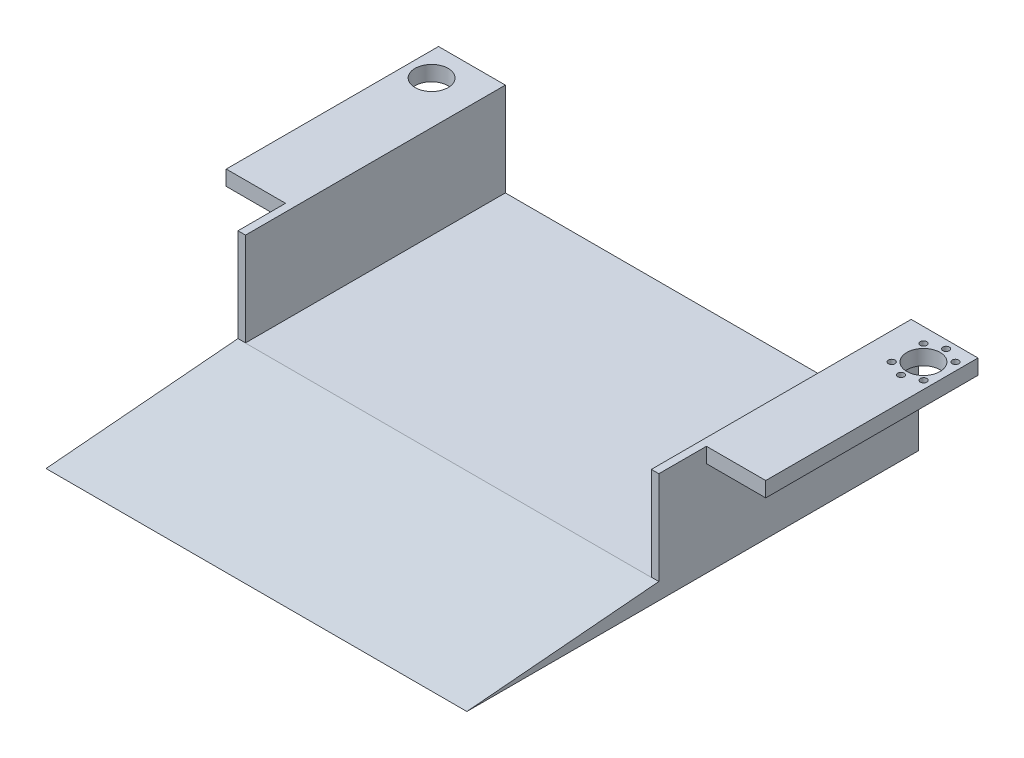
ISO-10303-21;
HEADER;
FILE_DESCRIPTION(('STEP AP214'),'2;1');
FILE_NAME('part.step','',(''),(''),'','','');
FILE_SCHEMA(('AUTOMOTIVE_DESIGN { 1 0 10303 214 1 1 1 1 }'));
ENDSEC;
DATA;
#1=APPLICATION_CONTEXT('core data for automotive mechanical design processes');
#2=APPLICATION_PROTOCOL_DEFINITION('international standard','automotive_design',2000,#1);
#3=PRODUCT_CONTEXT('',#1,'mechanical');
#4=PRODUCT('Part','Part','',(#3));
#5=PRODUCT_RELATED_PRODUCT_CATEGORY('part','',(#4));
#6=PRODUCT_DEFINITION_FORMATION('','',#4);
#7=PRODUCT_DEFINITION_CONTEXT('part definition',#1,'design');
#8=PRODUCT_DEFINITION('design','',#6,#7);
#9=PRODUCT_DEFINITION_SHAPE('','',#8);
#10=(LENGTH_UNIT() NAMED_UNIT(*) SI_UNIT(.MILLI.,.METRE.));
#11=(NAMED_UNIT(*) PLANE_ANGLE_UNIT() SI_UNIT($,.RADIAN.));
#12=(NAMED_UNIT(*) SI_UNIT($,.STERADIAN.) SOLID_ANGLE_UNIT());
#13=UNCERTAINTY_MEASURE_WITH_UNIT(LENGTH_MEASURE(1.E-05),#10,'distance_accuracy_value','');
#14=(GEOMETRIC_REPRESENTATION_CONTEXT(3) GLOBAL_UNCERTAINTY_ASSIGNED_CONTEXT((#13)) GLOBAL_UNIT_ASSIGNED_CONTEXT((#10,
#11,#12)) REPRESENTATION_CONTEXT('',''));
#15=CARTESIAN_POINT('',(0.,0.,0.));
#16=DIRECTION('',(0.,0.,1.));
#17=DIRECTION('',(1.,0.,0.));
#18=AXIS2_PLACEMENT_3D('',#15,#16,#17);
#19=CARTESIAN_POINT('',(0.,92.6973,0.));
#20=DIRECTION('',(0.,-1.,0.));
#21=DIRECTION('',(0.,0.,-1.));
#22=AXIS2_PLACEMENT_3D('',#19,#20,#21);
#23=PLANE('',#22);
#24=CARTESIAN_POINT('',(20.0659999999999,92.6973,-355.092));
#25=DIRECTION('',(0.,1.,0.));
#26=DIRECTION('',(0.,0.,1.));
#27=AXIS2_PLACEMENT_3D('',#24,#25,#26);
#28=CIRCLE('',#27,14.);
#29=CARTESIAN_POINT('',(20.0659999999999,92.6973,-341.092));
#30=VERTEX_POINT('',#29);
#31=EDGE_CURVE('E212',#30,#30,#28,.T.);
#32=ORIENTED_EDGE('',*,*,#31,.F.);
#33=EDGE_LOOP('',(#32));
#34=FACE_BOUND('',#33,.T.);
#35=DIRECTION('',(0.,0.,-1.));
#36=VECTOR('',#35,1.);
#37=CARTESIAN_POINT('',(50.0126,92.6973,0.));
#38=LINE('',#37,#36);
#39=CARTESIAN_POINT('',(50.0126,92.6973,-161.899498709285));
#40=VERTEX_POINT('',#39);
#41=CARTESIAN_POINT('',(50.0126,92.6973,-202.0062));
#42=VERTEX_POINT('',#41);
#43=EDGE_CURVE('E200',#40,#42,#38,.T.);
#44=ORIENTED_EDGE('',*,*,#43,.F.);
#45=DIRECTION('',(1.,0.,0.));
#46=VECTOR('',#45,1.);
#47=CARTESIAN_POINT('',(-1.66533453693773E-13,92.6973,-161.899498709285));
#48=LINE('',#47,#46);
#49=CARTESIAN_POINT('',(56.3626,92.6973,-161.899498709285));
#50=VERTEX_POINT('',#49);
#51=EDGE_CURVE('E463',#40,#50,#48,.T.);
#52=ORIENTED_EDGE('',*,*,#51,.T.);
#53=DIRECTION('',(0.,0.,1.));
#54=VECTOR('',#53,1.);
#55=CARTESIAN_POINT('',(56.3626,92.6973,-381.));
#56=LINE('',#55,#54);
#57=CARTESIAN_POINT('',(56.3626,92.6973,-381.));
#58=VERTEX_POINT('',#57);
#59=EDGE_CURVE('E247',#58,#50,#56,.T.);
#60=ORIENTED_EDGE('',*,*,#59,.F.);
#61=DIRECTION('',(-1.,0.,0.));
#62=VECTOR('',#61,1.);
#63=CARTESIAN_POINT('',(-1.11022302462516E-13,92.6973,-381.));
#64=LINE('',#63,#62);
#65=CARTESIAN_POINT('',(-1.11022302462516E-13,92.6973,-381.));
#66=VERTEX_POINT('',#65);
#67=EDGE_CURVE('E228',#58,#66,#64,.T.);
#68=ORIENTED_EDGE('',*,*,#67,.T.);
#69=DIRECTION('',(0.,0.,1.));
#70=VECTOR('',#69,1.);
#71=CARTESIAN_POINT('',(0.,92.6973,0.));
#72=LINE('',#71,#70);
#73=CARTESIAN_POINT('',(0.,92.6973,-202.0062));
#74=VERTEX_POINT('',#73);
#75=EDGE_CURVE('E221',#66,#74,#72,.T.);
#76=ORIENTED_EDGE('',*,*,#75,.T.);
#77=DIRECTION('',(-1.,0.,0.));
#78=VECTOR('',#77,1.);
#79=CARTESIAN_POINT('',(0.,92.6973,-202.0062));
#80=LINE('',#79,#78);
#81=EDGE_CURVE('E213',#42,#74,#80,.T.);
#82=ORIENTED_EDGE('',*,*,#81,.F.);
#83=EDGE_LOOP('',(#44,#52,#60,#68,#76,#82));
#84=FACE_BOUND('',#83,.T.);
#85=ADVANCED_FACE('F44',(#34,#84),#23,.F.);
#86=CARTESIAN_POINT('',(0.,92.6973,0.));
#87=DIRECTION('',(1.,0.,0.));
#88=DIRECTION('',(0.,0.,-1.));
#89=AXIS2_PLACEMENT_3D('',#86,#87,#88);
#90=PLANE('',#89);
#91=DIRECTION('',(0.,-1.,0.));
#92=VECTOR('',#91,1.);
#93=CARTESIAN_POINT('',(-1.11022302462516E-13,92.6973,-381.));
#94=LINE('',#93,#92);
#95=CARTESIAN_POINT('',(-1.66533453693774E-13,79.9974,-381.));
#96=VERTEX_POINT('',#95);
#97=EDGE_CURVE('E232',#66,#96,#94,.T.);
#98=ORIENTED_EDGE('',*,*,#97,.T.);
#99=DIRECTION('',(0.,0.,-1.));
#100=VECTOR('',#99,1.);
#101=CARTESIAN_POINT('',(-1.66533453693774E-13,79.9974,-381.));
#102=LINE('',#101,#100);
#103=CARTESIAN_POINT('',(0.,79.9974,-202.0062));
#104=VERTEX_POINT('',#103);
#105=EDGE_CURVE('E412',#104,#96,#102,.T.);
#106=ORIENTED_EDGE('',*,*,#105,.F.);
#107=DIRECTION('',(0.,1.,0.));
#108=VECTOR('',#107,1.);
#109=CARTESIAN_POINT('',(0.,0.,-202.0062));
#110=LINE('',#109,#108);
#111=EDGE_CURVE('E209',#104,#74,#110,.T.);
#112=ORIENTED_EDGE('',*,*,#111,.T.);
#113=ORIENTED_EDGE('',*,*,#75,.F.);
#114=EDGE_LOOP('',(#98,#106,#112,#113));
#115=FACE_BOUND('',#114,.T.);
#116=ADVANCED_FACE('F46',(#115),#90,.F.);
#117=CARTESIAN_POINT('',(454.914,92.6973,0.));
#118=DIRECTION('',(-1.,0.,0.));
#119=DIRECTION('',(0.,0.,1.));
#120=AXIS2_PLACEMENT_3D('',#117,#118,#119);
#121=PLANE('',#120);
#122=DIRECTION('',(0.,1.,0.));
#123=VECTOR('',#122,1.);
#124=CARTESIAN_POINT('',(454.914,0.,-202.0062));
#125=LINE('',#124,#123);
#126=CARTESIAN_POINT('',(454.914,79.9974,-202.0062));
#127=VERTEX_POINT('',#126);
#128=CARTESIAN_POINT('',(454.914,92.6973,-202.0062));
#129=VERTEX_POINT('',#128);
#130=EDGE_CURVE('E186',#127,#129,#125,.T.);
#131=ORIENTED_EDGE('',*,*,#130,.F.);
#132=DIRECTION('',(0.,0.,1.));
#133=VECTOR('',#132,1.);
#134=CARTESIAN_POINT('',(454.914,79.9974,-202.0062));
#135=LINE('',#134,#133);
#136=CARTESIAN_POINT('',(454.914,79.9974,-381.));
#137=VERTEX_POINT('',#136);
#138=EDGE_CURVE('E253',#137,#127,#135,.T.);
#139=ORIENTED_EDGE('',*,*,#138,.F.);
#140=DIRECTION('',(0.,-1.,0.));
#141=VECTOR('',#140,1.);
#142=CARTESIAN_POINT('',(454.914,92.6973,-381.));
#143=LINE('',#142,#141);
#144=CARTESIAN_POINT('',(454.914,92.6973,-381.));
#145=VERTEX_POINT('',#144);
#146=EDGE_CURVE('E239',#145,#137,#143,.T.);
#147=ORIENTED_EDGE('',*,*,#146,.F.);
#148=DIRECTION('',(0.,0.,-1.));
#149=VECTOR('',#148,1.);
#150=CARTESIAN_POINT('',(454.914,92.6973,0.));
#151=LINE('',#150,#149);
#152=EDGE_CURVE('E225',#129,#145,#151,.T.);
#153=ORIENTED_EDGE('',*,*,#152,.F.);
#154=EDGE_LOOP('',(#131,#139,#147,#153));
#155=FACE_BOUND('',#154,.T.);
#156=ADVANCED_FACE('F305',(#155),#121,.F.);
#157=CARTESIAN_POINT('',(-1.11022302462516E-13,92.6973,-381.));
#158=DIRECTION('',(0.,0.,1.));
#159=DIRECTION('',(1.,0.,0.));
#160=AXIS2_PLACEMENT_3D('',#157,#158,#159);
#161=PLANE('',#160);
#162=DIRECTION('',(0.,-1.,0.));
#163=VECTOR('',#162,1.);
#164=CARTESIAN_POINT('',(50.0125999999998,0.,-381.));
#165=LINE('',#164,#163);
#166=CARTESIAN_POINT('',(50.0125999999998,79.9974,-381.));
#167=VERTEX_POINT('',#166);
#168=CARTESIAN_POINT('',(50.0125999999998,0.,-381.));
#169=VERTEX_POINT('',#168);
#170=EDGE_CURVE('E417',#167,#169,#165,.T.);
#171=ORIENTED_EDGE('',*,*,#170,.F.);
#172=DIRECTION('',(-1.,0.,0.));
#173=VECTOR('',#172,1.);
#174=CARTESIAN_POINT('',(50.0125999999998,79.9974,-381.));
#175=LINE('',#174,#173);
#176=EDGE_CURVE('E254',#167,#96,#175,.T.);
#177=ORIENTED_EDGE('',*,*,#176,.T.);
#178=ORIENTED_EDGE('',*,*,#97,.F.);
#179=ORIENTED_EDGE('',*,*,#67,.F.);
#180=DIRECTION('',(0.,1.,0.));
#181=VECTOR('',#180,1.);
#182=CARTESIAN_POINT('',(56.3626,13.9573,-381.));
#183=LINE('',#182,#181);
#184=CARTESIAN_POINT('',(56.3626,13.9573,-381.));
#185=VERTEX_POINT('',#184);
#186=EDGE_CURVE('E368',#185,#58,#183,.T.);
#187=ORIENTED_EDGE('',*,*,#186,.F.);
#188=DIRECTION('',(-1.,0.,0.));
#189=VECTOR('',#188,1.);
#190=CARTESIAN_POINT('',(56.3626,13.9573,-381.));
#191=LINE('',#190,#189);
#192=CARTESIAN_POINT('',(398.5514,13.9573,-381.));
#193=VERTEX_POINT('',#192);
#194=EDGE_CURVE('E373',#193,#185,#191,.T.);
#195=ORIENTED_EDGE('',*,*,#194,.F.);
#196=DIRECTION('',(0.,1.,0.));
#197=VECTOR('',#196,1.);
#198=CARTESIAN_POINT('',(398.5514,13.9573,-381.));
#199=LINE('',#198,#197);
#200=CARTESIAN_POINT('',(398.5514,92.6973,-381.));
#201=VERTEX_POINT('',#200);
#202=EDGE_CURVE('E371',#193,#201,#199,.T.);
#203=ORIENTED_EDGE('',*,*,#202,.T.);
#204=EDGE_CURVE('E229',#145,#201,#64,.T.);
#205=ORIENTED_EDGE('',*,*,#204,.F.);
#206=ORIENTED_EDGE('',*,*,#146,.T.);
#207=DIRECTION('',(1.,0.,0.));
#208=VECTOR('',#207,1.);
#209=CARTESIAN_POINT('',(404.9014,79.9974,-381.));
#210=LINE('',#209,#208);
#211=CARTESIAN_POINT('',(404.9014,79.9974,-381.));
#212=VERTEX_POINT('',#211);
#213=EDGE_CURVE('E439',#212,#137,#210,.T.);
#214=ORIENTED_EDGE('',*,*,#213,.F.);
#215=DIRECTION('',(0.,1.,0.));
#216=VECTOR('',#215,1.);
#217=CARTESIAN_POINT('',(404.9014,0.,-381.));
#218=LINE('',#217,#216);
#219=CARTESIAN_POINT('',(404.9014,0.,-381.));
#220=VERTEX_POINT('',#219);
#221=EDGE_CURVE('E434',#220,#212,#218,.T.);
#222=ORIENTED_EDGE('',*,*,#221,.F.);
#223=DIRECTION('',(-1.,0.,0.));
#224=VECTOR('',#223,1.);
#225=CARTESIAN_POINT('',(-1.11022302462516E-13,0.,-381.));
#226=LINE('',#225,#224);
#227=EDGE_CURVE('E172',#220,#169,#226,.T.);
#228=ORIENTED_EDGE('',*,*,#227,.T.);
#229=EDGE_LOOP('',(#171,#177,#178,#179,#187,#195,#203,#205,#206,#214,#222,#228));
#230=FACE_BOUND('',#229,.T.);
#231=ADVANCED_FACE('F312',(#230),#161,.F.);
#232=CARTESIAN_POINT('',(434.848,92.6973,-374.174211984588));
#233=DIRECTION('',(0.,1.,0.));
#234=DIRECTION('',(0.,0.,1.));
#235=AXIS2_PLACEMENT_3D('',#232,#233,#234);
#236=CIRCLE('',#235,2.74999999999998);
#237=CARTESIAN_POINT('',(434.848,92.6973,-371.424211984588));
#238=VERTEX_POINT('',#237);
#239=EDGE_CURVE('E262',#238,#238,#236,.T.);
#240=ORIENTED_EDGE('',*,*,#239,.F.);
#241=EDGE_LOOP('',(#240));
#242=FACE_BOUND('',#241,.T.);
#243=CARTESIAN_POINT('',(421.412971157455,92.6973,-341.739183142044));
#244=DIRECTION('',(0.,1.,0.));
#245=DIRECTION('',(0.,0.,1.));
#246=AXIS2_PLACEMENT_3D('',#243,#244,#245);
#247=CIRCLE('',#246,2.74999999999998);
#248=CARTESIAN_POINT('',(421.412971157455,92.6973,-338.989183142044));
#249=VERTEX_POINT('',#248);
#250=EDGE_CURVE('E327',#249,#249,#247,.T.);
#251=ORIENTED_EDGE('',*,*,#250,.F.);
#252=EDGE_LOOP('',(#251));
#253=FACE_BOUND('',#252,.T.);
#254=CARTESIAN_POINT('',(434.848,92.6973,-336.174211984588));
#255=DIRECTION('',(0.,1.,0.));
#256=DIRECTION('',(0.,0.,1.));
#257=AXIS2_PLACEMENT_3D('',#254,#255,#256);
#258=CIRCLE('',#257,2.74999999999998);
#259=CARTESIAN_POINT('',(434.848,92.6973,-333.424211984588));
#260=VERTEX_POINT('',#259);
#261=EDGE_CURVE('E331',#260,#260,#258,.T.);
#262=ORIENTED_EDGE('',*,*,#261,.F.);
#263=EDGE_LOOP('',(#262));
#264=FACE_BOUND('',#263,.T.);
#265=CARTESIAN_POINT('',(448.283028842544,92.6973,-341.739183142044));
#266=DIRECTION('',(0.,1.,0.));
#267=DIRECTION('',(0.,0.,1.));
#268=AXIS2_PLACEMENT_3D('',#265,#266,#267);
#269=CIRCLE('',#268,2.74999999999991);
#270=CARTESIAN_POINT('',(448.283028842544,92.6973,-338.989183142044));
#271=VERTEX_POINT('',#270);
#272=EDGE_CURVE('E335',#271,#271,#269,.T.);
#273=ORIENTED_EDGE('',*,*,#272,.F.);
#274=EDGE_LOOP('',(#273));
#275=FACE_BOUND('',#274,.T.);
#276=CARTESIAN_POINT('',(421.412971157455,92.6973,-368.609240827133));
#277=DIRECTION('',(0.,1.,0.));
#278=DIRECTION('',(0.,0.,1.));
#279=AXIS2_PLACEMENT_3D('',#276,#277,#278);
#280=CIRCLE('',#279,2.74999999999998);
#281=CARTESIAN_POINT('',(421.412971157455,92.6973,-365.859240827133));
#282=VERTEX_POINT('',#281);
#283=EDGE_CURVE('E339',#282,#282,#280,.T.);
#284=ORIENTED_EDGE('',*,*,#283,.F.);
#285=EDGE_LOOP('',(#284));
#286=FACE_BOUND('',#285,.T.);
#287=CARTESIAN_POINT('',(448.283028842544,92.6973,-368.609240827133));
#288=DIRECTION('',(0.,1.,0.));
#289=DIRECTION('',(0.,0.,1.));
#290=AXIS2_PLACEMENT_3D('',#287,#288,#289);
#291=CIRCLE('',#290,2.74999999999998);
#292=CARTESIAN_POINT('',(448.283028842544,92.6973,-365.859240827133));
#293=VERTEX_POINT('',#292);
#294=EDGE_CURVE('E343',#293,#293,#291,.T.);
#295=ORIENTED_EDGE('',*,*,#294,.F.);
#296=EDGE_LOOP('',(#295));
#297=FACE_BOUND('',#296,.T.);
#298=CARTESIAN_POINT('',(434.848,92.6973,-355.092));
#299=DIRECTION('',(0.,1.,0.));
#300=DIRECTION('',(0.,0.,1.));
#301=AXIS2_PLACEMENT_3D('',#298,#299,#300);
#302=CIRCLE('',#301,14.);
#303=CARTESIAN_POINT('',(434.848,92.6973,-341.092));
#304=VERTEX_POINT('',#303);
#305=EDGE_CURVE('E196',#304,#304,#302,.T.);
#306=ORIENTED_EDGE('',*,*,#305,.F.);
#307=EDGE_LOOP('',(#306));
#308=FACE_BOUND('',#307,.T.);
#309=DIRECTION('',(0.,0.,-1.));
#310=VECTOR('',#309,1.);
#311=CARTESIAN_POINT('',(398.5514,92.6973,-381.));
#312=LINE('',#311,#310);
#313=CARTESIAN_POINT('',(398.5514,92.6973,-161.899498709285));
#314=VERTEX_POINT('',#313);
#315=EDGE_CURVE('E349',#314,#201,#312,.T.);
#316=ORIENTED_EDGE('',*,*,#315,.F.);
#317=CARTESIAN_POINT('',(404.9014,92.6973,-161.899498709285));
#318=VERTEX_POINT('',#317);
#319=EDGE_CURVE('E351',#314,#318,#48,.T.);
#320=ORIENTED_EDGE('',*,*,#319,.T.);
#321=DIRECTION('',(0.,0.,1.));
#322=VECTOR('',#321,1.);
#323=CARTESIAN_POINT('',(404.9014,92.6973,0.));
#324=LINE('',#323,#322);
#325=CARTESIAN_POINT('',(404.9014,92.6973,-202.0062));
#326=VERTEX_POINT('',#325);
#327=EDGE_CURVE('E187',#326,#318,#324,.T.);
#328=ORIENTED_EDGE('',*,*,#327,.F.);
#329=DIRECTION('',(-1.,0.,0.));
#330=VECTOR('',#329,1.);
#331=CARTESIAN_POINT('',(454.914,92.6973,-202.0062));
#332=LINE('',#331,#330);
#333=EDGE_CURVE('E192',#129,#326,#332,.T.);
#334=ORIENTED_EDGE('',*,*,#333,.F.);
#335=ORIENTED_EDGE('',*,*,#152,.T.);
#336=ORIENTED_EDGE('',*,*,#204,.T.);
#337=EDGE_LOOP('',(#316,#320,#328,#334,#335,#336));
#338=FACE_BOUND('',#337,.T.);
#339=ADVANCED_FACE('F299',(#242,#253,#264,#275,#286,#297,#308,#338),#23,.F.);
#340=CARTESIAN_POINT('',(0.,0.,0.));
#341=DIRECTION('',(0.,-1.,0.));
#342=DIRECTION('',(0.,0.,-1.));
#343=AXIS2_PLACEMENT_3D('',#340,#341,#342);
#344=PLANE('',#343);
#345=DIRECTION('',(0.,0.,-1.));
#346=VECTOR('',#345,1.);
#347=CARTESIAN_POINT('',(50.0126,0.,0.));
#348=LINE('',#347,#346);
#349=CARTESIAN_POINT('',(50.0126,0.,0.));
#350=VERTEX_POINT('',#349);
#351=EDGE_CURVE('E208',#350,#169,#348,.T.);
#352=ORIENTED_EDGE('',*,*,#351,.T.);
#353=ORIENTED_EDGE('',*,*,#227,.F.);
#354=DIRECTION('',(0.,0.,1.));
#355=VECTOR('',#354,1.);
#356=CARTESIAN_POINT('',(404.9014,0.,0.));
#357=LINE('',#356,#355);
#358=CARTESIAN_POINT('',(404.9014,0.,0.));
#359=VERTEX_POINT('',#358);
#360=EDGE_CURVE('E177',#220,#359,#357,.T.);
#361=ORIENTED_EDGE('',*,*,#360,.T.);
#362=DIRECTION('',(1.,0.,0.));
#363=VECTOR('',#362,1.);
#364=CARTESIAN_POINT('',(0.,0.,0.));
#365=LINE('',#364,#363);
#366=EDGE_CURVE('E160',#350,#359,#365,.T.);
#367=ORIENTED_EDGE('',*,*,#366,.F.);
#368=EDGE_LOOP('',(#352,#353,#361,#367));
#369=FACE_BOUND('',#368,.T.);
#370=ADVANCED_FACE('F183',(#369),#344,.T.);
#371=CARTESIAN_POINT('',(0.,0.,-202.0062));
#372=DIRECTION('',(0.,0.,-1.));
#373=DIRECTION('',(-1.,0.,0.));
#374=AXIS2_PLACEMENT_3D('',#371,#372,#373);
#375=PLANE('',#374);
#376=ORIENTED_EDGE('',*,*,#111,.F.);
#377=DIRECTION('',(-1.,0.,0.));
#378=VECTOR('',#377,1.);
#379=CARTESIAN_POINT('',(50.0125999999999,79.9974,-202.0062));
#380=LINE('',#379,#378);
#381=CARTESIAN_POINT('',(50.0125999999999,79.9974,-202.0062));
#382=VERTEX_POINT('',#381);
#383=EDGE_CURVE('E407',#382,#104,#380,.T.);
#384=ORIENTED_EDGE('',*,*,#383,.F.);
#385=DIRECTION('',(0.,1.,0.));
#386=VECTOR('',#385,1.);
#387=CARTESIAN_POINT('',(50.0126,0.,-202.0062));
#388=LINE('',#387,#386);
#389=EDGE_CURVE('E204',#382,#42,#388,.T.);
#390=ORIENTED_EDGE('',*,*,#389,.T.);
#391=ORIENTED_EDGE('',*,*,#81,.T.);
#392=EDGE_LOOP('',(#376,#384,#390,#391));
#393=FACE_BOUND('',#392,.T.);
#394=ADVANCED_FACE('F318',(#393),#375,.F.);
#395=CARTESIAN_POINT('',(50.0126,0.,0.));
#396=DIRECTION('',(1.,0.,0.));
#397=DIRECTION('',(0.,0.,-1.));
#398=AXIS2_PLACEMENT_3D('',#395,#396,#397);
#399=PLANE('',#398);
#400=DIRECTION('',(0.,0.0859686470677954,-0.996297842876985));
#401=VECTOR('',#400,1.);
#402=CARTESIAN_POINT('',(50.0126,0.,0.));
#403=LINE('',#402,#401);
#404=CARTESIAN_POINT('',(50.0126,13.97,-161.899498709285));
#405=VERTEX_POINT('',#404);
#406=EDGE_CURVE('E167',#350,#405,#403,.T.);
#407=ORIENTED_EDGE('',*,*,#406,.T.);
#408=DIRECTION('',(0.,1.,0.));
#409=VECTOR('',#408,1.);
#410=CARTESIAN_POINT('',(50.0126,0.,-161.899498709285));
#411=LINE('',#410,#409);
#412=EDGE_CURVE('E418',#405,#40,#411,.T.);
#413=ORIENTED_EDGE('',*,*,#412,.T.);
#414=ORIENTED_EDGE('',*,*,#43,.T.);
#415=ORIENTED_EDGE('',*,*,#389,.F.);
#416=DIRECTION('',(0.,0.,-1.));
#417=VECTOR('',#416,1.);
#418=CARTESIAN_POINT('',(50.0125999999998,79.9974,-381.));
#419=LINE('',#418,#417);
#420=EDGE_CURVE('E423',#382,#167,#419,.T.);
#421=ORIENTED_EDGE('',*,*,#420,.T.);
#422=ORIENTED_EDGE('',*,*,#170,.T.);
#423=ORIENTED_EDGE('',*,*,#351,.F.);
#424=EDGE_LOOP('',(#407,#413,#414,#415,#421,#422,#423));
#425=FACE_BOUND('',#424,.T.);
#426=ADVANCED_FACE('F397',(#425),#399,.F.);
#427=CARTESIAN_POINT('',(404.9014,0.,0.));
#428=DIRECTION('',(-1.,0.,0.));
#429=DIRECTION('',(0.,0.,1.));
#430=AXIS2_PLACEMENT_3D('',#427,#428,#429);
#431=PLANE('',#430);
#432=ORIENTED_EDGE('',*,*,#327,.T.);
#433=DIRECTION('',(0.,1.,0.));
#434=VECTOR('',#433,1.);
#435=CARTESIAN_POINT('',(404.9014,92.6973,-161.899498709285));
#436=LINE('',#435,#434);
#437=CARTESIAN_POINT('',(404.9014,13.97,-161.899498709285));
#438=VERTEX_POINT('',#437);
#439=EDGE_CURVE('E179',#438,#318,#436,.T.);
#440=ORIENTED_EDGE('',*,*,#439,.F.);
#441=DIRECTION('',(0.,0.0859686470677953,-0.996297842876985));
#442=VECTOR('',#441,1.);
#443=CARTESIAN_POINT('',(404.9014,0.,0.));
#444=LINE('',#443,#442);
#445=EDGE_CURVE('E163',#359,#438,#444,.T.);
#446=ORIENTED_EDGE('',*,*,#445,.F.);
#447=ORIENTED_EDGE('',*,*,#360,.F.);
#448=ORIENTED_EDGE('',*,*,#221,.T.);
#449=DIRECTION('',(0.,0.,1.));
#450=VECTOR('',#449,1.);
#451=CARTESIAN_POINT('',(404.9014,79.9974,-202.0062));
#452=LINE('',#451,#450);
#453=CARTESIAN_POINT('',(404.9014,79.9974,-202.0062));
#454=VERTEX_POINT('',#453);
#455=EDGE_CURVE('E70',#212,#454,#452,.T.);
#456=ORIENTED_EDGE('',*,*,#455,.T.);
#457=DIRECTION('',(0.,1.,0.));
#458=VECTOR('',#457,1.);
#459=CARTESIAN_POINT('',(404.9014,0.,-202.0062));
#460=LINE('',#459,#458);
#461=EDGE_CURVE('E173',#454,#326,#460,.T.);
#462=ORIENTED_EDGE('',*,*,#461,.T.);
#463=EDGE_LOOP('',(#432,#440,#446,#447,#448,#456,#462));
#464=FACE_BOUND('',#463,.T.);
#465=ADVANCED_FACE('F176',(#464),#431,.F.);
#466=CARTESIAN_POINT('',(454.914,0.,-202.0062));
#467=DIRECTION('',(0.,0.,-1.));
#468=DIRECTION('',(-1.,0.,0.));
#469=AXIS2_PLACEMENT_3D('',#466,#467,#468);
#470=PLANE('',#469);
#471=ORIENTED_EDGE('',*,*,#461,.F.);
#472=DIRECTION('',(1.,0.,0.));
#473=VECTOR('',#472,1.);
#474=CARTESIAN_POINT('',(404.9014,79.9974,-202.0062));
#475=LINE('',#474,#473);
#476=EDGE_CURVE('E248',#454,#127,#475,.T.);
#477=ORIENTED_EDGE('',*,*,#476,.T.);
#478=ORIENTED_EDGE('',*,*,#130,.T.);
#479=ORIENTED_EDGE('',*,*,#333,.T.);
#480=EDGE_LOOP('',(#471,#477,#478,#479));
#481=FACE_BOUND('',#480,.T.);
#482=ADVANCED_FACE('F382',(#481),#470,.F.);
#483=CARTESIAN_POINT('',(434.848,0.,-355.092));
#484=DIRECTION('',(0.,1.,0.));
#485=DIRECTION('',(0.,0.,1.));
#486=AXIS2_PLACEMENT_3D('',#483,#484,#485);
#487=CYLINDRICAL_SURFACE('',#486,14.);
#488=CARTESIAN_POINT('',(434.848,79.9974,-355.092));
#489=DIRECTION('',(0.,1.,0.));
#490=DIRECTION('',(0.,0.,1.));
#491=AXIS2_PLACEMENT_3D('',#488,#489,#490);
#492=CIRCLE('',#491,14.);
#493=CARTESIAN_POINT('',(434.848,79.9974,-341.092));
#494=VERTEX_POINT('',#493);
#495=EDGE_CURVE('E243',#494,#494,#492,.F.);
#496=ORIENTED_EDGE('',*,*,#495,.T.);
#497=EDGE_LOOP('',(#496));
#498=FACE_BOUND('',#497,.T.);
#499=ORIENTED_EDGE('',*,*,#305,.T.);
#500=EDGE_LOOP('',(#499));
#501=FACE_BOUND('',#500,.T.);
#502=ADVANCED_FACE('F379',(#498,#501),#487,.F.);
#503=CARTESIAN_POINT('',(20.0659999999999,0.,-355.092));
#504=DIRECTION('',(0.,1.,0.));
#505=DIRECTION('',(0.,0.,1.));
#506=AXIS2_PLACEMENT_3D('',#503,#504,#505);
#507=CYLINDRICAL_SURFACE('',#506,14.);
#508=CARTESIAN_POINT('',(20.0659999999999,79.9974,-355.092));
#509=DIRECTION('',(0.,1.,0.));
#510=DIRECTION('',(0.,0.,1.));
#511=AXIS2_PLACEMENT_3D('',#508,#509,#510);
#512=CIRCLE('',#511,14.);
#513=CARTESIAN_POINT('',(20.0659999999999,79.9974,-341.092));
#514=VERTEX_POINT('',#513);
#515=EDGE_CURVE('E249',#514,#514,#512,.F.);
#516=ORIENTED_EDGE('',*,*,#515,.T.);
#517=EDGE_LOOP('',(#516));
#518=FACE_BOUND('',#517,.T.);
#519=ORIENTED_EDGE('',*,*,#31,.T.);
#520=EDGE_LOOP('',(#519));
#521=FACE_BOUND('',#520,.T.);
#522=ADVANCED_FACE('F381',(#518,#521),#507,.F.);
#523=CARTESIAN_POINT('',(56.3626,13.9573,-381.));
#524=DIRECTION('',(-1.,0.,0.));
#525=DIRECTION('',(0.,0.,1.));
#526=AXIS2_PLACEMENT_3D('',#523,#524,#525);
#527=PLANE('',#526);
#528=ORIENTED_EDGE('',*,*,#59,.T.);
#529=DIRECTION('',(0.,-1.,0.));
#530=VECTOR('',#529,1.);
#531=CARTESIAN_POINT('',(56.3626,13.9573,-161.899498709285));
#532=LINE('',#531,#530);
#533=CARTESIAN_POINT('',(56.3626,13.97,-161.899498709285));
#534=VERTEX_POINT('',#533);
#535=EDGE_CURVE('E426',#50,#534,#532,.T.);
#536=ORIENTED_EDGE('',*,*,#535,.T.);
#537=DIRECTION('',(0.,-0.0859686470677954,0.996297842876985));
#538=VECTOR('',#537,1.);
#539=CARTESIAN_POINT('',(56.3626,32.7359468134615,-379.379626261505));
#540=LINE('',#539,#538);
#541=CARTESIAN_POINT('',(56.3626,13.9573,-161.752317346821));
#542=VERTEX_POINT('',#541);
#543=EDGE_CURVE('E469',#534,#542,#540,.T.);
#544=ORIENTED_EDGE('',*,*,#543,.T.);
#545=DIRECTION('',(0.,0.,1.));
#546=VECTOR('',#545,1.);
#547=CARTESIAN_POINT('',(56.3626,13.9573,-381.));
#548=LINE('',#547,#546);
#549=EDGE_CURVE('E357',#185,#542,#548,.T.);
#550=ORIENTED_EDGE('',*,*,#549,.F.);
#551=ORIENTED_EDGE('',*,*,#186,.T.);
#552=EDGE_LOOP('',(#528,#536,#544,#550,#551));
#553=FACE_BOUND('',#552,.T.);
#554=ADVANCED_FACE('F389',(#553),#527,.F.);
#555=CARTESIAN_POINT('',(398.5514,13.9573,-381.));
#556=DIRECTION('',(1.,0.,0.));
#557=DIRECTION('',(0.,0.,-1.));
#558=AXIS2_PLACEMENT_3D('',#555,#556,#557);
#559=PLANE('',#558);
#560=DIRECTION('',(0.,0.0859686470677954,-0.996297842876985));
#561=VECTOR('',#560,1.);
#562=CARTESIAN_POINT('',(398.5514,32.7359468134615,-379.379626261505));
#563=LINE('',#562,#561);
#564=CARTESIAN_POINT('',(398.5514,13.9573,-161.752317346821));
#565=VERTEX_POINT('',#564);
#566=CARTESIAN_POINT('',(398.5514,13.97,-161.899498709285));
#567=VERTEX_POINT('',#566);
#568=EDGE_CURVE('E62',#565,#567,#563,.T.);
#569=ORIENTED_EDGE('',*,*,#568,.T.);
#570=DIRECTION('',(0.,1.,0.));
#571=VECTOR('',#570,1.);
#572=CARTESIAN_POINT('',(398.5514,13.9573,-161.899498709285));
#573=LINE('',#572,#571);
#574=EDGE_CURVE('E11',#567,#314,#573,.T.);
#575=ORIENTED_EDGE('',*,*,#574,.T.);
#576=ORIENTED_EDGE('',*,*,#315,.T.);
#577=ORIENTED_EDGE('',*,*,#202,.F.);
#578=DIRECTION('',(0.,0.,-1.));
#579=VECTOR('',#578,1.);
#580=CARTESIAN_POINT('',(398.5514,13.9573,-381.));
#581=LINE('',#580,#579);
#582=EDGE_CURVE('E362',#565,#193,#581,.T.);
#583=ORIENTED_EDGE('',*,*,#582,.F.);
#584=EDGE_LOOP('',(#569,#575,#576,#577,#583));
#585=FACE_BOUND('',#584,.T.);
#586=ADVANCED_FACE('F488',(#585),#559,.F.);
#587=CARTESIAN_POINT('',(0.,13.9573,0.));
#588=DIRECTION('',(0.,1.,0.));
#589=DIRECTION('',(0.,0.,1.));
#590=AXIS2_PLACEMENT_3D('',#587,#588,#589);
#591=PLANE('',#590);
#592=DIRECTION('',(-1.,0.,0.));
#593=VECTOR('',#592,1.);
#594=CARTESIAN_POINT('',(0.,13.9573,-161.752317346821));
#595=LINE('',#594,#593);
#596=EDGE_CURVE('E54',#565,#542,#595,.T.);
#597=ORIENTED_EDGE('',*,*,#596,.F.);
#598=ORIENTED_EDGE('',*,*,#582,.T.);
#599=ORIENTED_EDGE('',*,*,#194,.T.);
#600=ORIENTED_EDGE('',*,*,#549,.T.);
#601=EDGE_LOOP('',(#597,#598,#599,#600));
#602=FACE_BOUND('',#601,.T.);
#603=ADVANCED_FACE('F453',(#602),#591,.T.);
#604=CARTESIAN_POINT('',(404.9014,79.9974,-202.0062));
#605=DIRECTION('',(0.,1.,0.));
#606=DIRECTION('',(0.,0.,1.));
#607=AXIS2_PLACEMENT_3D('',#604,#605,#606);
#608=PLANE('',#607);
#609=CARTESIAN_POINT('',(434.848,79.9974,-374.174211984588));
#610=DIRECTION('',(0.,1.,0.));
#611=DIRECTION('',(0.,0.,1.));
#612=AXIS2_PLACEMENT_3D('',#609,#610,#611);
#613=CIRCLE('',#612,2.74999999999998);
#614=CARTESIAN_POINT('',(434.848,79.9974,-371.424211984588));
#615=VERTEX_POINT('',#614);
#616=EDGE_CURVE('E48',#615,#615,#613,.T.);
#617=ORIENTED_EDGE('',*,*,#616,.T.);
#618=EDGE_LOOP('',(#617));
#619=FACE_BOUND('',#618,.T.);
#620=CARTESIAN_POINT('',(421.412971157455,79.9974,-341.739183142044));
#621=DIRECTION('',(0.,1.,0.));
#622=DIRECTION('',(0.,0.,1.));
#623=AXIS2_PLACEMENT_3D('',#620,#621,#622);
#624=CIRCLE('',#623,2.74999999999998);
#625=CARTESIAN_POINT('',(421.412971157455,79.9974,-338.989183142044));
#626=VERTEX_POINT('',#625);
#627=EDGE_CURVE('E273',#626,#626,#624,.T.);
#628=ORIENTED_EDGE('',*,*,#627,.T.);
#629=EDGE_LOOP('',(#628));
#630=FACE_BOUND('',#629,.T.);
#631=CARTESIAN_POINT('',(434.848,79.9974,-336.174211984588));
#632=DIRECTION('',(0.,1.,0.));
#633=DIRECTION('',(0.,0.,1.));
#634=AXIS2_PLACEMENT_3D('',#631,#632,#633);
#635=CIRCLE('',#634,2.74999999999998);
#636=CARTESIAN_POINT('',(434.848,79.9974,-333.424211984588));
#637=VERTEX_POINT('',#636);
#638=EDGE_CURVE('E270',#637,#637,#635,.T.);
#639=ORIENTED_EDGE('',*,*,#638,.T.);
#640=EDGE_LOOP('',(#639));
#641=FACE_BOUND('',#640,.T.);
#642=CARTESIAN_POINT('',(448.283028842544,79.9974,-341.739183142044));
#643=DIRECTION('',(0.,1.,0.));
#644=DIRECTION('',(0.,0.,1.));
#645=AXIS2_PLACEMENT_3D('',#642,#643,#644);
#646=CIRCLE('',#645,2.74999999999991);
#647=CARTESIAN_POINT('',(448.283028842544,79.9974,-338.989183142044));
#648=VERTEX_POINT('',#647);
#649=EDGE_CURVE('E266',#648,#648,#646,.T.);
#650=ORIENTED_EDGE('',*,*,#649,.T.);
#651=EDGE_LOOP('',(#650));
#652=FACE_BOUND('',#651,.T.);
#653=CARTESIAN_POINT('',(421.412971157455,79.9974,-368.609240827133));
#654=DIRECTION('',(0.,1.,0.));
#655=DIRECTION('',(0.,0.,1.));
#656=AXIS2_PLACEMENT_3D('',#653,#654,#655);
#657=CIRCLE('',#656,2.74999999999998);
#658=CARTESIAN_POINT('',(421.412971157455,79.9974,-365.859240827133));
#659=VERTEX_POINT('',#658);
#660=EDGE_CURVE('E261',#659,#659,#657,.T.);
#661=ORIENTED_EDGE('',*,*,#660,.T.);
#662=EDGE_LOOP('',(#661));
#663=FACE_BOUND('',#662,.T.);
#664=CARTESIAN_POINT('',(448.283028842544,79.9974,-368.609240827133));
#665=DIRECTION('',(0.,1.,0.));
#666=DIRECTION('',(0.,0.,1.));
#667=AXIS2_PLACEMENT_3D('',#664,#665,#666);
#668=CIRCLE('',#667,2.74999999999998);
#669=CARTESIAN_POINT('',(448.283028842544,79.9974,-365.859240827133));
#670=VERTEX_POINT('',#669);
#671=EDGE_CURVE('E257',#670,#670,#668,.T.);
#672=ORIENTED_EDGE('',*,*,#671,.T.);
#673=EDGE_LOOP('',(#672));
#674=FACE_BOUND('',#673,.T.);
#675=ORIENTED_EDGE('',*,*,#138,.T.);
#676=ORIENTED_EDGE('',*,*,#476,.F.);
#677=ORIENTED_EDGE('',*,*,#455,.F.);
#678=ORIENTED_EDGE('',*,*,#213,.T.);
#679=EDGE_LOOP('',(#675,#676,#677,#678));
#680=FACE_BOUND('',#679,.T.);
#681=ORIENTED_EDGE('',*,*,#495,.F.);
#682=EDGE_LOOP('',(#681));
#683=FACE_BOUND('',#682,.T.);
#684=ADVANCED_FACE('F282',(#619,#630,#641,#652,#663,#674,#680,#683),#608,.F.);
#685=CARTESIAN_POINT('',(50.0125999999998,79.9974,-381.));
#686=DIRECTION('',(0.,1.,0.));
#687=DIRECTION('',(0.,0.,1.));
#688=AXIS2_PLACEMENT_3D('',#685,#686,#687);
#689=PLANE('',#688);
#690=ORIENTED_EDGE('',*,*,#105,.T.);
#691=ORIENTED_EDGE('',*,*,#176,.F.);
#692=ORIENTED_EDGE('',*,*,#420,.F.);
#693=ORIENTED_EDGE('',*,*,#383,.T.);
#694=EDGE_LOOP('',(#690,#691,#692,#693));
#695=FACE_BOUND('',#694,.T.);
#696=ORIENTED_EDGE('',*,*,#515,.F.);
#697=EDGE_LOOP('',(#696));
#698=FACE_BOUND('',#697,.T.);
#699=ADVANCED_FACE('F499',(#695,#698),#689,.F.);
#700=CARTESIAN_POINT('',(-1.66533453693773E-13,92.6973,-161.899498709285));
#701=DIRECTION('',(0.,0.,-1.));
#702=DIRECTION('',(-1.,0.,0.));
#703=AXIS2_PLACEMENT_3D('',#700,#701,#702);
#704=PLANE('',#703);
#705=DIRECTION('',(1.,0.,0.));
#706=VECTOR('',#705,1.);
#707=CARTESIAN_POINT('',(-1.66533453693773E-13,13.97,-161.899498709285));
#708=LINE('',#707,#706);
#709=EDGE_CURVE('E471',#405,#534,#708,.T.);
#710=ORIENTED_EDGE('',*,*,#709,.T.);
#711=ORIENTED_EDGE('',*,*,#535,.F.);
#712=ORIENTED_EDGE('',*,*,#51,.F.);
#713=ORIENTED_EDGE('',*,*,#412,.F.);
#714=EDGE_LOOP('',(#710,#711,#712,#713));
#715=FACE_BOUND('',#714,.T.);
#716=ADVANCED_FACE('F483',(#715),#704,.F.);
#717=EDGE_CURVE('E474',#567,#438,#708,.T.);
#718=ORIENTED_EDGE('',*,*,#717,.T.);
#719=ORIENTED_EDGE('',*,*,#439,.T.);
#720=ORIENTED_EDGE('',*,*,#319,.F.);
#721=ORIENTED_EDGE('',*,*,#574,.F.);
#722=EDGE_LOOP('',(#718,#719,#720,#721));
#723=FACE_BOUND('',#722,.T.);
#724=ADVANCED_FACE('F487',(#723),#704,.F.);
#725=CARTESIAN_POINT('',(-1.66533453693773E-13,0.,0.));
#726=DIRECTION('',(0.,-0.996297842876985,-0.0859686470677954));
#727=DIRECTION('',(0.,0.0859686470677954,-0.996297842876985));
#728=AXIS2_PLACEMENT_3D('',#725,#726,#727);
#729=PLANE('',#728);
#730=ORIENTED_EDGE('',*,*,#366,.T.);
#731=ORIENTED_EDGE('',*,*,#445,.T.);
#732=ORIENTED_EDGE('',*,*,#717,.F.);
#733=ORIENTED_EDGE('',*,*,#568,.F.);
#734=ORIENTED_EDGE('',*,*,#596,.T.);
#735=ORIENTED_EDGE('',*,*,#543,.F.);
#736=ORIENTED_EDGE('',*,*,#709,.F.);
#737=ORIENTED_EDGE('',*,*,#406,.F.);
#738=EDGE_LOOP('',(#730,#731,#732,#733,#734,#735,#736,#737));
#739=FACE_BOUND('',#738,.T.);
#740=ADVANCED_FACE('F162',(#739),#729,.F.);
#741=CARTESIAN_POINT('',(448.283028842544,0.,-368.609240827133));
#742=DIRECTION('',(0.,1.,0.));
#743=DIRECTION('',(0.,0.,1.));
#744=AXIS2_PLACEMENT_3D('',#741,#742,#743);
#745=CYLINDRICAL_SURFACE('',#744,2.74999999999998);
#746=ORIENTED_EDGE('',*,*,#294,.T.);
#747=EDGE_LOOP('',(#746));
#748=FACE_BOUND('',#747,.T.);
#749=ORIENTED_EDGE('',*,*,#671,.F.);
#750=EDGE_LOOP('',(#749));
#751=FACE_BOUND('',#750,.T.);
#752=ADVANCED_FACE('F546',(#748,#751),#745,.F.);
#753=CARTESIAN_POINT('',(421.412971157455,0.,-368.609240827133));
#754=DIRECTION('',(0.,1.,0.));
#755=DIRECTION('',(0.,0.,1.));
#756=AXIS2_PLACEMENT_3D('',#753,#754,#755);
#757=CYLINDRICAL_SURFACE('',#756,2.74999999999998);
#758=ORIENTED_EDGE('',*,*,#283,.T.);
#759=EDGE_LOOP('',(#758));
#760=FACE_BOUND('',#759,.T.);
#761=ORIENTED_EDGE('',*,*,#660,.F.);
#762=EDGE_LOOP('',(#761));
#763=FACE_BOUND('',#762,.T.);
#764=ADVANCED_FACE('F556',(#760,#763),#757,.F.);
#765=CARTESIAN_POINT('',(448.283028842544,0.,-341.739183142044));
#766=DIRECTION('',(0.,1.,0.));
#767=DIRECTION('',(0.,0.,1.));
#768=AXIS2_PLACEMENT_3D('',#765,#766,#767);
#769=CYLINDRICAL_SURFACE('',#768,2.74999999999991);
#770=ORIENTED_EDGE('',*,*,#272,.T.);
#771=EDGE_LOOP('',(#770));
#772=FACE_BOUND('',#771,.T.);
#773=ORIENTED_EDGE('',*,*,#649,.F.);
#774=EDGE_LOOP('',(#773));
#775=FACE_BOUND('',#774,.T.);
#776=ADVANCED_FACE('F566',(#772,#775),#769,.F.);
#777=CARTESIAN_POINT('',(434.848,0.,-336.174211984588));
#778=DIRECTION('',(0.,1.,0.));
#779=DIRECTION('',(0.,0.,1.));
#780=AXIS2_PLACEMENT_3D('',#777,#778,#779);
#781=CYLINDRICAL_SURFACE('',#780,2.74999999999998);
#782=ORIENTED_EDGE('',*,*,#261,.T.);
#783=EDGE_LOOP('',(#782));
#784=FACE_BOUND('',#783,.T.);
#785=ORIENTED_EDGE('',*,*,#638,.F.);
#786=EDGE_LOOP('',(#785));
#787=FACE_BOUND('',#786,.T.);
#788=ADVANCED_FACE('F292',(#784,#787),#781,.F.);
#789=CARTESIAN_POINT('',(421.412971157455,0.,-341.739183142044));
#790=DIRECTION('',(0.,1.,0.));
#791=DIRECTION('',(0.,0.,1.));
#792=AXIS2_PLACEMENT_3D('',#789,#790,#791);
#793=CYLINDRICAL_SURFACE('',#792,2.74999999999998);
#794=ORIENTED_EDGE('',*,*,#250,.T.);
#795=EDGE_LOOP('',(#794));
#796=FACE_BOUND('',#795,.T.);
#797=ORIENTED_EDGE('',*,*,#627,.F.);
#798=EDGE_LOOP('',(#797));
#799=FACE_BOUND('',#798,.T.);
#800=ADVANCED_FACE('F286',(#796,#799),#793,.F.);
#801=CARTESIAN_POINT('',(434.848,0.,-374.174211984588));
#802=DIRECTION('',(0.,1.,0.));
#803=DIRECTION('',(0.,0.,1.));
#804=AXIS2_PLACEMENT_3D('',#801,#802,#803);
#805=CYLINDRICAL_SURFACE('',#804,2.74999999999998);
#806=ORIENTED_EDGE('',*,*,#239,.T.);
#807=EDGE_LOOP('',(#806));
#808=FACE_BOUND('',#807,.T.);
#809=ORIENTED_EDGE('',*,*,#616,.F.);
#810=EDGE_LOOP('',(#809));
#811=FACE_BOUND('',#810,.T.);
#812=ADVANCED_FACE('F284',(#808,#811),#805,.F.);
#813=CLOSED_SHELL('',(#85,#116,#156,#231,#339,#370,#394,#426,#465,#482,#502,#522,#554,#586,#603,
#684,#699,#716,#724,#740,#752,#764,#776,#788,#800,#812));
#814=MANIFOLD_SOLID_BREP('B2',#813);
#815=ADVANCED_BREP_SHAPE_REPRESENTATION('',(#18,#814),#14);
#816=SHAPE_DEFINITION_REPRESENTATION(#9,#815);
ENDSEC;
END-ISO-10303-21;
